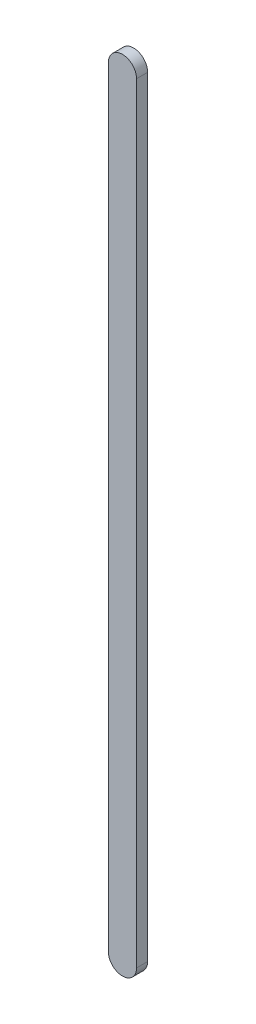
ISO-10303-21;
HEADER;
FILE_DESCRIPTION(('STEP AP214'),'2;1');
FILE_NAME('part.step','',(''),(''),'','','');
FILE_SCHEMA(('AUTOMOTIVE_DESIGN { 1 0 10303 214 1 1 1 1 }'));
ENDSEC;
DATA;
#1=APPLICATION_CONTEXT('core data for automotive mechanical design processes');
#2=APPLICATION_PROTOCOL_DEFINITION('international standard','automotive_design',2000,#1);
#3=PRODUCT_CONTEXT('',#1,'mechanical');
#4=PRODUCT('Part','Part','',(#3));
#5=PRODUCT_RELATED_PRODUCT_CATEGORY('part','',(#4));
#6=PRODUCT_DEFINITION_FORMATION('','',#4);
#7=PRODUCT_DEFINITION_CONTEXT('part definition',#1,'design');
#8=PRODUCT_DEFINITION('design','',#6,#7);
#9=PRODUCT_DEFINITION_SHAPE('','',#8);
#10=(LENGTH_UNIT() NAMED_UNIT(*) SI_UNIT(.MILLI.,.METRE.));
#11=(NAMED_UNIT(*) PLANE_ANGLE_UNIT() SI_UNIT($,.RADIAN.));
#12=(NAMED_UNIT(*) SI_UNIT($,.STERADIAN.) SOLID_ANGLE_UNIT());
#13=UNCERTAINTY_MEASURE_WITH_UNIT(LENGTH_MEASURE(1.E-05),#10,'distance_accuracy_value','');
#14=(GEOMETRIC_REPRESENTATION_CONTEXT(3) GLOBAL_UNCERTAINTY_ASSIGNED_CONTEXT((#13)) GLOBAL_UNIT_ASSIGNED_CONTEXT((#10,
#11,#12)) REPRESENTATION_CONTEXT('',''));
#15=CARTESIAN_POINT('',(0.,0.,0.));
#16=DIRECTION('',(0.,0.,1.));
#17=DIRECTION('',(1.,0.,0.));
#18=AXIS2_PLACEMENT_3D('',#15,#16,#17);
#19=CARTESIAN_POINT('',(100.203,61.6780072,0.));
#20=DIRECTION('',(-1.,0.,0.));
#21=DIRECTION('',(0.,1.,0.));
#22=AXIS2_PLACEMENT_3D('',#19,#20,#21);
#23=PLANE('',#22);
#24=DIRECTION('',(0.,1.,0.));
#25=VECTOR('',#24,1.);
#26=CARTESIAN_POINT('',(100.203,61.6780072,0.1999996));
#27=LINE('',#26,#25);
#28=CARTESIAN_POINT('',(100.203,61.6780072,0.1999996));
#29=VERTEX_POINT('',#28);
#30=CARTESIAN_POINT('',(100.203,75.565,0.1999996));
#31=VERTEX_POINT('',#30);
#32=EDGE_CURVE('E11',#29,#31,#27,.T.);
#33=ORIENTED_EDGE('',*,*,#32,.F.);
#34=DIRECTION('',(0.,0.,1.));
#35=VECTOR('',#34,1.);
#36=CARTESIAN_POINT('',(100.203,61.6780072,0.));
#37=LINE('',#36,#35);
#38=CARTESIAN_POINT('',(100.203,61.6780072,0.));
#39=VERTEX_POINT('',#38);
#40=EDGE_CURVE('E24',#39,#29,#37,.T.);
#41=ORIENTED_EDGE('',*,*,#40,.F.);
#42=DIRECTION('',(0.,1.,0.));
#43=VECTOR('',#42,1.);
#44=CARTESIAN_POINT('',(100.203,61.6780072,0.));
#45=LINE('',#44,#43);
#46=CARTESIAN_POINT('',(100.203,75.565,0.));
#47=VERTEX_POINT('',#46);
#48=EDGE_CURVE('E75',#39,#47,#45,.T.);
#49=ORIENTED_EDGE('',*,*,#48,.T.);
#50=DIRECTION('',(0.,0.,1.));
#51=VECTOR('',#50,1.);
#52=CARTESIAN_POINT('',(100.203,75.565,0.));
#53=LINE('',#52,#51);
#54=EDGE_CURVE('E37',#47,#31,#53,.T.);
#55=ORIENTED_EDGE('',*,*,#54,.T.);
#56=EDGE_LOOP('',(#33,#41,#49,#55));
#57=FACE_BOUND('',#56,.T.);
#58=ADVANCED_FACE('F17',(#57),#23,.F.);
#59=CARTESIAN_POINT('',(99.949,75.565,0.));
#60=DIRECTION('',(0.,0.,-1.));
#61=DIRECTION('',(1.,0.,0.));
#62=AXIS2_PLACEMENT_3D('',#59,#60,#61);
#63=CYLINDRICAL_SURFACE('',#62,0.254);
#64=CARTESIAN_POINT('',(99.949,75.565,0.1999996));
#65=DIRECTION('',(0.,0.,1.));
#66=DIRECTION('',(1.,0.,0.));
#67=AXIS2_PLACEMENT_3D('',#64,#65,#66);
#68=CIRCLE('',#67,0.254);
#69=CARTESIAN_POINT('',(99.695,75.565,0.1999996));
#70=VERTEX_POINT('',#69);
#71=EDGE_CURVE('E83',#31,#70,#68,.T.);
#72=ORIENTED_EDGE('',*,*,#71,.F.);
#73=ORIENTED_EDGE('',*,*,#54,.F.);
#74=CARTESIAN_POINT('',(99.949,75.565,0.));
#75=DIRECTION('',(0.,0.,1.));
#76=DIRECTION('',(1.,0.,0.));
#77=AXIS2_PLACEMENT_3D('',#74,#75,#76);
#78=CIRCLE('',#77,0.254);
#79=CARTESIAN_POINT('',(99.695,75.565,0.));
#80=VERTEX_POINT('',#79);
#81=EDGE_CURVE('E81',#47,#80,#78,.T.);
#82=ORIENTED_EDGE('',*,*,#81,.T.);
#83=DIRECTION('',(0.,0.,1.));
#84=VECTOR('',#83,1.);
#85=CARTESIAN_POINT('',(99.695,75.565,0.));
#86=LINE('',#85,#84);
#87=EDGE_CURVE('E67',#80,#70,#86,.T.);
#88=ORIENTED_EDGE('',*,*,#87,.T.);
#89=EDGE_LOOP('',(#72,#73,#82,#88));
#90=FACE_BOUND('',#89,.T.);
#91=ADVANCED_FACE('F89',(#90),#63,.T.);
#92=CARTESIAN_POINT('',(99.695,75.565,0.));
#93=DIRECTION('',(1.,0.,0.));
#94=DIRECTION('',(0.,-1.,0.));
#95=AXIS2_PLACEMENT_3D('',#92,#93,#94);
#96=PLANE('',#95);
#97=DIRECTION('',(0.,-1.,0.));
#98=VECTOR('',#97,1.);
#99=CARTESIAN_POINT('',(99.695,75.565,0.1999996));
#100=LINE('',#99,#98);
#101=CARTESIAN_POINT('',(99.695,61.6780072,0.1999996));
#102=VERTEX_POINT('',#101);
#103=EDGE_CURVE('E71',#70,#102,#100,.T.);
#104=ORIENTED_EDGE('',*,*,#103,.F.);
#105=ORIENTED_EDGE('',*,*,#87,.F.);
#106=DIRECTION('',(0.,-1.,0.));
#107=VECTOR('',#106,1.);
#108=CARTESIAN_POINT('',(99.695,75.565,0.));
#109=LINE('',#108,#107);
#110=CARTESIAN_POINT('',(99.695,61.6780072,0.));
#111=VERTEX_POINT('',#110);
#112=EDGE_CURVE('E63',#80,#111,#109,.T.);
#113=ORIENTED_EDGE('',*,*,#112,.T.);
#114=DIRECTION('',(0.,0.,1.));
#115=VECTOR('',#114,1.);
#116=CARTESIAN_POINT('',(99.695,61.6780072,0.));
#117=LINE('',#116,#115);
#118=EDGE_CURVE('E53',#111,#102,#117,.T.);
#119=ORIENTED_EDGE('',*,*,#118,.T.);
#120=EDGE_LOOP('',(#104,#105,#113,#119));
#121=FACE_BOUND('',#120,.T.);
#122=ADVANCED_FACE('F66',(#121),#96,.F.);
#123=CARTESIAN_POINT('',(99.949,61.6780072,0.));
#124=DIRECTION('',(0.,0.,-1.));
#125=DIRECTION('',(-1.,0.,0.));
#126=AXIS2_PLACEMENT_3D('',#123,#124,#125);
#127=CYLINDRICAL_SURFACE('',#126,0.254000000000003);
#128=CARTESIAN_POINT('',(99.949,61.6780072,0.1999996));
#129=DIRECTION('',(0.,0.,1.));
#130=DIRECTION('',(-1.,0.,0.));
#131=AXIS2_PLACEMENT_3D('',#128,#129,#130);
#132=CIRCLE('',#131,0.254000000000003);
#133=EDGE_CURVE('E59',#102,#29,#132,.T.);
#134=ORIENTED_EDGE('',*,*,#133,.F.);
#135=ORIENTED_EDGE('',*,*,#118,.F.);
#136=CARTESIAN_POINT('',(99.949,61.6780072,0.));
#137=DIRECTION('',(0.,0.,1.));
#138=DIRECTION('',(-1.,0.,0.));
#139=AXIS2_PLACEMENT_3D('',#136,#137,#138);
#140=CIRCLE('',#139,0.254000000000003);
#141=EDGE_CURVE('E57',#111,#39,#140,.T.);
#142=ORIENTED_EDGE('',*,*,#141,.T.);
#143=ORIENTED_EDGE('',*,*,#40,.T.);
#144=EDGE_LOOP('',(#134,#135,#142,#143));
#145=FACE_BOUND('',#144,.T.);
#146=ADVANCED_FACE('F55',(#145),#127,.T.);
#147=CARTESIAN_POINT('',(100.203,61.6780072,0.));
#148=DIRECTION('',(0.,0.,-1.));
#149=DIRECTION('',(-1.,0.,0.));
#150=AXIS2_PLACEMENT_3D('',#147,#148,#149);
#151=PLANE('',#150);
#152=ORIENTED_EDGE('',*,*,#141,.F.);
#153=ORIENTED_EDGE('',*,*,#112,.F.);
#154=ORIENTED_EDGE('',*,*,#81,.F.);
#155=ORIENTED_EDGE('',*,*,#48,.F.);
#156=EDGE_LOOP('',(#152,#153,#154,#155));
#157=FACE_BOUND('',#156,.T.);
#158=ADVANCED_FACE('F74',(#157),#151,.T.);
#159=CARTESIAN_POINT('',(100.203,61.6780072,0.1999996));
#160=DIRECTION('',(0.,0.,-1.));
#161=DIRECTION('',(-1.,0.,0.));
#162=AXIS2_PLACEMENT_3D('',#159,#160,#161);
#163=PLANE('',#162);
#164=ORIENTED_EDGE('',*,*,#32,.T.);
#165=ORIENTED_EDGE('',*,*,#71,.T.);
#166=ORIENTED_EDGE('',*,*,#103,.T.);
#167=ORIENTED_EDGE('',*,*,#133,.T.);
#168=EDGE_LOOP('',(#164,#165,#166,#167));
#169=FACE_BOUND('',#168,.T.);
#170=ADVANCED_FACE('F91',(#169),#163,.F.);
#171=CLOSED_SHELL('',(#58,#91,#122,#146,#158,#170));
#172=MANIFOLD_SOLID_BREP('B1',#171);
#173=ADVANCED_BREP_SHAPE_REPRESENTATION('',(#18,#172),#14);
#174=SHAPE_DEFINITION_REPRESENTATION(#9,#173);
ENDSEC;
END-ISO-10303-21;
